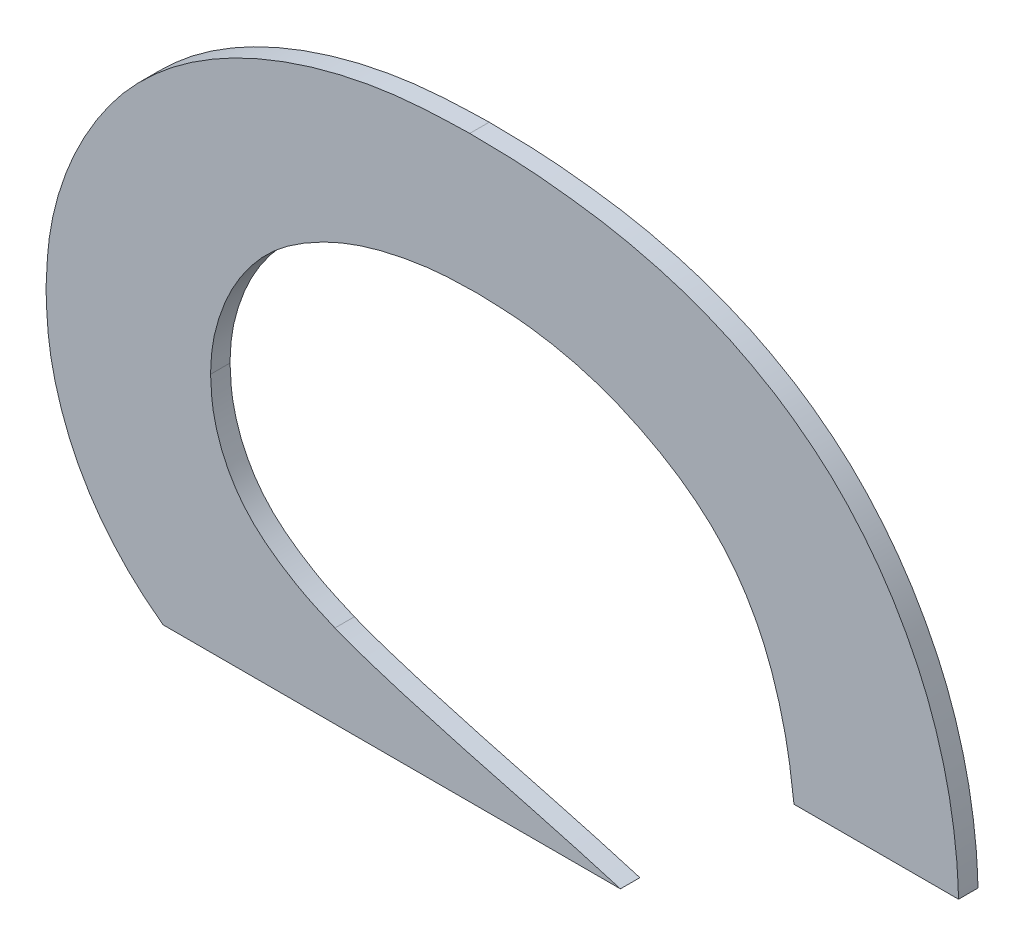
ISO-10303-21;
HEADER;
FILE_DESCRIPTION(('STEP AP214'),'2;1');
FILE_NAME('part.step','',(''),(''),'','','');
FILE_SCHEMA(('AUTOMOTIVE_DESIGN { 1 0 10303 214 1 1 1 1 }'));
ENDSEC;
DATA;
#1=APPLICATION_CONTEXT('core data for automotive mechanical design processes');
#2=APPLICATION_PROTOCOL_DEFINITION('international standard','automotive_design',2000,#1);
#3=PRODUCT_CONTEXT('',#1,'mechanical');
#4=PRODUCT('Part','Part','',(#3));
#5=PRODUCT_RELATED_PRODUCT_CATEGORY('part','',(#4));
#6=PRODUCT_DEFINITION_FORMATION('','',#4);
#7=PRODUCT_DEFINITION_CONTEXT('part definition',#1,'design');
#8=PRODUCT_DEFINITION('design','',#6,#7);
#9=PRODUCT_DEFINITION_SHAPE('','',#8);
#10=(LENGTH_UNIT() NAMED_UNIT(*) SI_UNIT(.MILLI.,.METRE.));
#11=(NAMED_UNIT(*) PLANE_ANGLE_UNIT() SI_UNIT($,.RADIAN.));
#12=(NAMED_UNIT(*) SI_UNIT($,.STERADIAN.) SOLID_ANGLE_UNIT());
#13=UNCERTAINTY_MEASURE_WITH_UNIT(LENGTH_MEASURE(1.E-05),#10,'distance_accuracy_value','');
#14=(GEOMETRIC_REPRESENTATION_CONTEXT(3) GLOBAL_UNCERTAINTY_ASSIGNED_CONTEXT((#13)) GLOBAL_UNIT_ASSIGNED_CONTEXT((#10,
#11,#12)) REPRESENTATION_CONTEXT('',''));
#15=CARTESIAN_POINT('',(0.,0.,0.));
#16=DIRECTION('',(0.,0.,1.));
#17=DIRECTION('',(1.,0.,0.));
#18=AXIS2_PLACEMENT_3D('',#15,#16,#17);
#19=CARTESIAN_POINT('',(-4.11057692307693,2.63822115384615,0.5));
#20=CARTESIAN_POINT('',(-4.00488563491304,2.59484832968436,0.5));
#21=CARTESIAN_POINT('',(-3.76610981470805,2.49686124064652,0.5));
#22=CARTESIAN_POINT('',(-3.35685527949907,2.36715662740571,0.5));
#23=CARTESIAN_POINT('',(-2.87124370624223,2.19936163482354,0.5));
#24=CARTESIAN_POINT('',(-2.29933905732658,2.0274498742162,0.5));
#25=CARTESIAN_POINT('',(-1.64054876163488,1.84325418191542,0.5));
#26=CARTESIAN_POINT('',(-0.900915829956285,1.6312743935958,0.5));
#27=CARTESIAN_POINT('',(-0.0745724746301278,1.41053081331135,0.5));
#28=CARTESIAN_POINT('',(0.809542130683225,1.17684129858742,0.5));
#29=CARTESIAN_POINT('',(1.70446327038373,0.939812681982956,0.5));
#30=CARTESIAN_POINT('',(2.55933319638908,0.697455477380349,0.5));
#31=CARTESIAN_POINT('',(3.3507051088732,0.467590704325735,0.5));
#32=CARTESIAN_POINT('',(4.07556666863736,0.231341690606483,0.5));
#33=CARTESIAN_POINT('',(4.73461203592151,-0.00182823693737234,0.5));
#34=CARTESIAN_POINT('',(5.32964173384311,-0.230412348593631,0.5));
#35=CARTESIAN_POINT('',(5.86171425100135,-0.448722393173916,0.5));
#36=CARTESIAN_POINT('',(6.1866759407189,-0.609273403606434,0.5));
#37=CARTESIAN_POINT('',(6.34014423076923,-0.685096153846154,0.5));
#38=B_SPLINE_CURVE_WITH_KNOTS('',3,(#19,#20,#21,#22,#23,#24,#25,#26,#27,#28,#29,#30,#31,#32,#33,
#34,#35,#36,#37),.UNSPECIFIED.,.F.,.F.,(4,1,1,1,1,1,1,1,1,1,1,1,1,1,1,1,4),(0.,
0.0312005486837909,0.0704877074756246,0.117216473764155,0.171577933057924,0.233598664496505,
0.304114665578319,0.381780268712742,0.467272049488307,0.553962424494241,0.634702640990441,
0.710032621623598,0.779089305911882,0.842963443203923,0.900999818556514,0.953245600815253,1.),.UNSPECIFIED.);
#39=DIRECTION('',(0.,0.,1.));
#40=VECTOR('',#39,1.);
#41=SURFACE_OF_LINEAR_EXTRUSION('',#38,#40);
#42=CARTESIAN_POINT('',(-4.11057692307693,2.63822115384615,1.));
#43=CARTESIAN_POINT('',(-4.00488563491304,2.59484832968436,1.));
#44=CARTESIAN_POINT('',(-3.76610981470805,2.49686124064652,1.));
#45=CARTESIAN_POINT('',(-3.35685527949907,2.36715662740571,1.));
#46=CARTESIAN_POINT('',(-2.87124370624223,2.19936163482354,1.));
#47=CARTESIAN_POINT('',(-2.29933905732658,2.0274498742162,1.));
#48=CARTESIAN_POINT('',(-1.64054876163488,1.84325418191542,1.));
#49=CARTESIAN_POINT('',(-0.900915829956285,1.6312743935958,1.));
#50=CARTESIAN_POINT('',(-0.0745724746301278,1.41053081331135,1.));
#51=CARTESIAN_POINT('',(0.809542130683225,1.17684129858742,1.));
#52=CARTESIAN_POINT('',(1.70446327038373,0.939812681982956,1.));
#53=CARTESIAN_POINT('',(2.5118826485852,0.710907795414684,1.));
#54=CARTESIAN_POINT('',(3.01321470962642,0.565590876212145,1.));
#55=CARTESIAN_POINT('',(3.22990136181697,0.499989275649873,1.));
#56=B_SPLINE_CURVE_WITH_KNOTS('',3,(#42,#43,#44,#45,#46,#47,#48,#49,#50,#51,#52,#53,#54,#55),
.UNSPECIFIED.,.F.,.F.,(4,1,1,1,1,1,1,1,1,1,1,4),(0.,0.0312005486837909,0.0704877074756246,
0.117216473764155,0.171577933057924,0.233598664496505,0.304114665578319,0.381780268712742,
0.467272049488307,0.553962424494241,0.634702640990441,0.696557914206025),.UNSPECIFIED.);
#57=CARTESIAN_POINT('',(-4.11057692307693,2.63822115384615,1.));
#58=VERTEX_POINT('',#57);
#59=CARTESIAN_POINT('',(3.22990463264559,0.5,1.000025));
#60=VERTEX_POINT('',#59);
#61=EDGE_CURVE('E154',#58,#60,#56,.T.);
#62=ORIENTED_EDGE('',*,*,#61,.T.);
#63=DIRECTION('',(0.,0.,1.));
#64=VECTOR('',#63,1.);
#65=CARTESIAN_POINT('',(3.22986593845968,0.5,0.5));
#66=LINE('',#65,#64);
#67=CARTESIAN_POINT('',(3.22986597011107,0.5,0.5));
#68=VERTEX_POINT('',#67);
#69=EDGE_CURVE('E59',#60,#68,#66,.F.);
#70=ORIENTED_EDGE('',*,*,#69,.T.);
#71=CARTESIAN_POINT('',(-4.11057692307693,2.63822115384615,0.5));
#72=VERTEX_POINT('',#71);
#73=EDGE_CURVE('E130',#72,#68,#38,.T.);
#74=ORIENTED_EDGE('',*,*,#73,.F.);
#75=DIRECTION('',(0.,0.,1.));
#76=VECTOR('',#75,1.);
#77=CARTESIAN_POINT('',(-4.11057692307693,2.63822115384615,0.5));
#78=LINE('',#77,#76);
#79=EDGE_CURVE('E121',#72,#58,#78,.T.);
#80=ORIENTED_EDGE('',*,*,#79,.T.);
#81=EDGE_LOOP('',(#62,#70,#74,#80));
#82=FACE_BOUND('',#81,.T.);
#83=ADVANCED_FACE('F39',(#82),#41,.F.);
#84=CARTESIAN_POINT('',(-6.33413461538462,-0.769230769230769,0.5));
#85=CARTESIAN_POINT('',(-6.54987491010937,-0.669834901235198,0.5));
#86=CARTESIAN_POINT('',(-6.97333695426159,-0.47473746941149,0.5));
#87=CARTESIAN_POINT('',(-7.57252879000224,-0.140673929581436,0.5));
#88=CARTESIAN_POINT('',(-8.1352725755817,0.203254546695419,0.5));
#89=CARTESIAN_POINT('',(-8.64404485130398,0.582245472711802,0.5));
#90=CARTESIAN_POINT('',(-9.12384569204833,0.961743307487882,0.5));
#91=CARTESIAN_POINT('',(-9.55020307049261,1.37201275767485,0.5));
#92=CARTESIAN_POINT('',(-9.9322881781385,1.80340001840364,0.5));
#93=CARTESIAN_POINT('',(-10.3848849345274,2.39611039997635,0.5));
#94=CARTESIAN_POINT('',(-10.8491453548823,3.19611819473388,0.5));
#95=CARTESIAN_POINT('',(-11.2480287422914,4.23007263462684,0.5));
#96=CARTESIAN_POINT('',(-11.4975406108777,5.33476645352021,0.5));
#97=CARTESIAN_POINT('',(-11.524652430869,6.09643002795245,0.5));
#98=CARTESIAN_POINT('',(-11.5384615384615,6.484375,0.5));
#99=B_SPLINE_CURVE_WITH_KNOTS('',3,(#84,#85,#86,#87,#88,#89,#90,#91,#92,#93,#94,#95,#96,#97,
#98),.UNSPECIFIED.,.F.,.F.,(4,1,1,1,1,1,1,1,1,1,1,1,4),(0.,0.0749469658775914,0.147108334184966,
0.216409674186856,0.282932407800131,0.347217926398502,0.409378758984855,0.469396312600535,
0.528959181231001,0.644562709826563,0.759868442406739,0.877691629841046,1.),.UNSPECIFIED.);
#100=DIRECTION('',(0.,0.,1.));
#101=VECTOR('',#100,1.);
#102=SURFACE_OF_LINEAR_EXTRUSION('',#99,#101);
#103=CARTESIAN_POINT('',(-8.53108296981489,0.499999998261416,0.5));
#104=VERTEX_POINT('',#103);
#105=CARTESIAN_POINT('',(-11.5384615384615,6.484375,0.5));
#106=VERTEX_POINT('',#105);
#107=EDGE_CURVE('E122',#104,#106,#99,.T.);
#108=ORIENTED_EDGE('',*,*,#107,.F.);
#109=DIRECTION('',(0.,0.,1.));
#110=VECTOR('',#109,1.);
#111=CARTESIAN_POINT('',(-8.53108297211848,0.499999999999961,0.5));
#112=LINE('',#111,#110);
#113=CARTESIAN_POINT('',(-8.53108297215093,0.499999999999981,1.));
#114=VERTEX_POINT('',#113);
#115=EDGE_CURVE('E109',#104,#114,#112,.T.);
#116=ORIENTED_EDGE('',*,*,#115,.T.);
#117=CARTESIAN_POINT('',(-6.33413461538462,-0.769230769230769,1.));
#118=CARTESIAN_POINT('',(-6.54987491010937,-0.669834901235198,1.));
#119=CARTESIAN_POINT('',(-6.97333695426159,-0.47473746941149,1.));
#120=CARTESIAN_POINT('',(-7.57252879000224,-0.140673929581436,1.));
#121=CARTESIAN_POINT('',(-8.1352725755817,0.203254546695419,1.));
#122=CARTESIAN_POINT('',(-8.64404485130398,0.582245472711802,1.));
#123=CARTESIAN_POINT('',(-9.12384569204833,0.961743307487882,1.));
#124=CARTESIAN_POINT('',(-9.55020307049261,1.37201275767485,1.));
#125=CARTESIAN_POINT('',(-9.9322881781385,1.80340001840364,1.));
#126=CARTESIAN_POINT('',(-10.3848849345274,2.39611039997635,1.));
#127=CARTESIAN_POINT('',(-10.8491453548823,3.19611819473388,1.));
#128=CARTESIAN_POINT('',(-11.2480287422914,4.23007263462684,1.));
#129=CARTESIAN_POINT('',(-11.4975406108777,5.33476645352021,1.));
#130=CARTESIAN_POINT('',(-11.524652430869,6.09643002795245,1.));
#131=CARTESIAN_POINT('',(-11.5384615384615,6.484375,1.));
#132=B_SPLINE_CURVE_WITH_KNOTS('',3,(#117,#118,#119,#120,#121,#122,#123,#124,#125,#126,#127,
#128,#129,#130,#131),.UNSPECIFIED.,.F.,.F.,(4,1,1,1,1,1,1,1,1,1,1,1,4),(0.,0.0749469658775914,
0.147108334184966,0.216409674186856,0.282932407800131,0.347217926398502,0.409378758984855,
0.469396312600535,0.528959181231001,0.644562709826563,0.759868442406739,0.877691629841046,1.),.UNSPECIFIED.);
#133=CARTESIAN_POINT('',(-11.5384615384615,6.484375,1.));
#134=VERTEX_POINT('',#133);
#135=EDGE_CURVE('E123',#114,#134,#132,.T.);
#136=ORIENTED_EDGE('',*,*,#135,.T.);
#137=DIRECTION('',(0.,0.,1.));
#138=VECTOR('',#137,1.);
#139=CARTESIAN_POINT('',(-11.5384615384615,6.484375,0.5));
#140=LINE('',#139,#138);
#141=EDGE_CURVE('E11',#106,#134,#140,.T.);
#142=ORIENTED_EDGE('',*,*,#141,.F.);
#143=EDGE_LOOP('',(#108,#116,#136,#142));
#144=FACE_BOUND('',#143,.T.);
#145=ADVANCED_FACE('F116',(#144),#102,.F.);
#146=CARTESIAN_POINT('',(8.143057134103,12.8301208020986,0.5));
#147=DIRECTION('',(0.,0.,1.));
#148=DIRECTION('',(1.,0.,0.));
#149=AXIS2_PLACEMENT_3D('',#146,#147,#148);
#150=PLANE('',#149);
#151=ORIENTED_EDGE('',*,*,#73,.T.);
#152=DIRECTION('',(-1.,0.,0.));
#153=VECTOR('',#152,1.);
#154=CARTESIAN_POINT('',(8.143057134103,0.5,0.5));
#155=LINE('',#154,#153);
#156=EDGE_CURVE('E127',#68,#104,#155,.T.);
#157=ORIENTED_EDGE('',*,*,#156,.T.);
#158=ORIENTED_EDGE('',*,*,#107,.T.);
#159=CARTESIAN_POINT('',(-11.5384615384615,6.484375,0.5));
#160=CARTESIAN_POINT('',(-11.5225576215417,6.87638526498406,0.5));
#161=CARTESIAN_POINT('',(-11.490903658382,7.65661308864469,0.5));
#162=CARTESIAN_POINT('',(-11.2263730788978,8.80495949089993,0.5));
#163=CARTESIAN_POINT('',(-10.8019246925907,9.91540908347788,0.5));
#164=CARTESIAN_POINT('',(-10.3106668393468,10.7963752693933,0.5));
#165=CARTESIAN_POINT('',(-9.84443875315438,11.4702710474641,0.5));
#166=CARTESIAN_POINT('',(-9.45291305126322,11.9546766294584,0.5));
#167=CARTESIAN_POINT('',(-9.01869917537449,12.4025724829247,0.5));
#168=CARTESIAN_POINT('',(-8.55252743938567,12.8280066132326,0.5));
#169=CARTESIAN_POINT('',(-8.05076576578978,13.2222873362771,0.5));
#170=CARTESIAN_POINT('',(-7.5091939873683,13.5855791407353,0.5));
#171=CARTESIAN_POINT('',(-6.9335001808275,13.9215505243502,0.5));
#172=CARTESIAN_POINT('',(-6.11153811204496,14.3314100828789,0.5));
#173=CARTESIAN_POINT('',(-5.01853352981579,14.757031912679,0.5));
#174=CARTESIAN_POINT('',(-3.63054327775144,15.1261990078088,0.5));
#175=CARTESIAN_POINT('',(-2.16242376669399,15.3449482282785,0.5));
#176=CARTESIAN_POINT('',(-1.15659361485031,15.3712076433537,0.5));
#177=CARTESIAN_POINT('',(-0.643028846153849,15.3846153846154,0.5));
#178=B_SPLINE_CURVE_WITH_KNOTS('',3,(#159,#160,#161,#162,#163,#164,#165,#166,#167,#168,#169,
#170,#171,#172,#173,#174,#175,#176,#177),.UNSPECIFIED.,.F.,.F.,(4,1,1,1,1,1,1,1,1,1,1,1,1,1,1,1,
4),(0.,0.0748117115240047,0.148899618404312,0.223875566693112,0.301295956829367,
0.340890212879302,0.38033440242574,0.420118666246839,0.459939719666905,0.500818643036389,
0.541892326895964,0.584421526484038,0.628060421576672,0.717241857708062,0.807927775014171,
0.901930233830183,1.),.UNSPECIFIED.);
#179=CARTESIAN_POINT('',(-0.643028846153849,15.3846153846154,0.5));
#180=VERTEX_POINT('',#179);
#181=EDGE_CURVE('E196',#106,#180,#178,.T.);
#182=ORIENTED_EDGE('',*,*,#181,.T.);
#183=CARTESIAN_POINT('',(-0.643028846153849,15.3846153846154,0.5));
#184=CARTESIAN_POINT('',(-0.316432315942807,15.381573958658,0.5));
#185=CARTESIAN_POINT('',(0.325322874606511,15.3755976217584,0.5));
#186=CARTESIAN_POINT('',(1.26624928914583,15.3163462373829,0.5));
#187=CARTESIAN_POINT('',(2.16537313488566,15.2092957624701,0.5));
#188=CARTESIAN_POINT('',(3.02629156849099,15.0853879943502,0.5));
#189=CARTESIAN_POINT('',(3.84494325787476,14.8991576800147,0.5));
#190=CARTESIAN_POINT('',(4.62602560000437,14.6890294642314,0.5));
#191=CARTESIAN_POINT('',(5.36241383764557,14.4254165104329,0.5));
#192=CARTESIAN_POINT('',(6.0622169595001,14.1353845457881,0.5));
#193=CARTESIAN_POINT('',(6.71902831170855,13.7926823427161,0.5));
#194=CARTESIAN_POINT('',(7.34663864691437,13.4253859364261,0.5));
#195=CARTESIAN_POINT('',(7.92986033230254,13.0040520971958,0.5));
#196=CARTESIAN_POINT('',(8.48597333825746,12.5572305060815,0.5));
#197=CARTESIAN_POINT('',(8.99819847099631,12.0601496740678,0.5));
#198=CARTESIAN_POINT('',(9.47246234599136,11.5244094200153,0.5));
#199=CARTESIAN_POINT('',(9.9139197574496,10.9512271849259,0.5));
#200=CARTESIAN_POINT('',(10.3147442116856,10.339983317138,0.5));
#201=CARTESIAN_POINT('',(10.6725686956029,9.69768654580665,0.5));
#202=CARTESIAN_POINT('',(10.9947001111911,9.03550068099126,0.5));
#203=CARTESIAN_POINT('',(11.264282464694,8.34989351224467,0.5));
#204=CARTESIAN_POINT('',(11.4864407196589,7.64247684810131,0.5));
#205=CARTESIAN_POINT('',(11.6682931361049,6.91646203900332,0.5));
#206=CARTESIAN_POINT('',(11.7979594494024,6.16701296410265,0.5));
#207=CARTESIAN_POINT('',(11.8920890650247,5.3988312723119,0.5));
#208=CARTESIAN_POINT('',(11.9126866254421,4.87807601963552,0.5));
#209=CARTESIAN_POINT('',(11.9230769230769,4.61538461538461,0.5));
#210=B_SPLINE_CURVE_WITH_KNOTS('',3,(#183,#184,#185,#186,#187,#188,#189,#190,#191,#192,#193,
#194,#195,#196,#197,#198,#199,#200,#201,#202,#203,#204,#205,#206,#207,#208,#209),.UNSPECIFIED.,
.F.,.F.,(4,1,1,1,1,1,1,1,1,1,1,1,1,1,1,1,1,1,1,1,1,1,1,1,4),(0.,0.0524970732681834,
0.103155625189081,0.151446900106166,0.198036575027614,0.242883227500694,0.286320436007602,
0.327974832728672,0.368524234979793,0.407985003019775,0.446973898177788,0.485305667733629,
0.523527722287358,0.561559399691927,0.599880347178225,0.638460186486789,0.677757696945738,
0.717260486447785,0.756579100491773,0.796045123661361,0.835559723648034,0.875703056245892,
0.916256294104429,0.957756063744298,1.),.UNSPECIFIED.);
#211=CARTESIAN_POINT('',(11.9230769230769,4.61538461538461,0.5));
#212=VERTEX_POINT('',#211);
#213=EDGE_CURVE('E209',#180,#212,#210,.T.);
#214=ORIENTED_EDGE('',*,*,#213,.T.);
#215=DIRECTION('',(-1.,0.,0.));
#216=VECTOR('',#215,1.);
#217=CARTESIAN_POINT('',(11.9230769230769,4.61538461538461,0.5));
#218=LINE('',#217,#216);
#219=CARTESIAN_POINT('',(7.69230769230769,4.61538461538461,0.5));
#220=VERTEX_POINT('',#219);
#221=EDGE_CURVE('E251',#212,#220,#218,.T.);
#222=ORIENTED_EDGE('',*,*,#221,.T.);
#223=CARTESIAN_POINT('',(7.69230769230769,4.61538461538461,0.5));
#224=CARTESIAN_POINT('',(7.64587787474954,4.99530713753295,0.5));
#225=CARTESIAN_POINT('',(7.55668369503909,5.72515876088058,0.5));
#226=CARTESIAN_POINT('',(7.30531345790411,6.75869479961788,0.5));
#227=CARTESIAN_POINT('',(6.98864581756741,7.69036663653895,0.5));
#228=CARTESIAN_POINT('',(6.57197195884964,8.51921807268415,0.5));
#229=CARTESIAN_POINT('',(6.06018848324613,9.26497379863621,0.5));
#230=CARTESIAN_POINT('',(5.41986707195258,9.92539822823579,0.5));
#231=CARTESIAN_POINT('',(4.65095157179606,10.5051357324702,0.5));
#232=CARTESIAN_POINT('',(3.77157005159758,11.000847134862,0.5));
#233=CARTESIAN_POINT('',(2.80934883085643,11.4184131811532,0.5));
#234=CARTESIAN_POINT('',(1.77278155163136,11.7113430003302,0.5));
#235=CARTESIAN_POINT('',(0.677210589100653,11.8889758757304,0.5));
#236=CARTESIAN_POINT('',(-0.0734375650773165,11.9115501367873,0.5));
#237=CARTESIAN_POINT('',(-0.456730769230772,11.9230769230769,0.5));
#238=B_SPLINE_CURVE_WITH_KNOTS('',3,(#223,#224,#225,#226,#227,#228,#229,#230,#231,#232,#233,
#234,#235,#236,#237),.UNSPECIFIED.,.F.,.F.,(4,1,1,1,1,1,1,1,1,1,1,1,4),(0.,0.0938134373941734,
0.180220664957644,0.260410288357706,0.334686523362959,0.407066114797914,0.48143493828116,
0.559271549945897,0.642465597837718,0.728536848906627,0.815944257740894,0.906018132728787,1.),.UNSPECIFIED.);
#239=CARTESIAN_POINT('',(-0.456730769230772,11.9230769230769,0.5));
#240=VERTEX_POINT('',#239);
#241=EDGE_CURVE('E275',#220,#240,#238,.T.);
#242=ORIENTED_EDGE('',*,*,#241,.T.);
#243=CARTESIAN_POINT('',(-0.456730769230772,11.9230769230769,0.5));
#244=CARTESIAN_POINT('',(-0.795849386530795,11.9167707334124,0.5));
#245=CARTESIAN_POINT('',(-1.45508090461675,11.9045117810171,0.5));
#246=CARTESIAN_POINT('',(-2.41252036035202,11.7582061635775,0.5));
#247=CARTESIAN_POINT('',(-3.31090380299915,11.5417598516276,0.5));
#248=CARTESIAN_POINT('',(-4.14052558842798,11.2304603284967,0.5));
#249=CARTESIAN_POINT('',(-4.88471292665653,10.8391539068335,0.5));
#250=CARTESIAN_POINT('',(-5.54527430096077,10.3923440842166,0.5));
#251=CARTESIAN_POINT('',(-6.0931400703211,9.85986201567553,0.5));
#252=CARTESIAN_POINT('',(-6.53630891911056,9.271334779326,0.5));
#253=CARTESIAN_POINT('',(-6.88023275644289,8.64637115441223,0.5));
#254=CARTESIAN_POINT('',(-7.12000437248346,8.00162539233591,0.5));
#255=CARTESIAN_POINT('',(-7.28143433068,7.34965267945314,0.5));
#256=CARTESIAN_POINT('',(-7.29898116346477,6.90797385569359,0.5));
#257=CARTESIAN_POINT('',(-7.30769230769231,6.68870192307692,0.5));
#258=B_SPLINE_CURVE_WITH_KNOTS('',3,(#243,#244,#245,#246,#247,#248,#249,#250,#251,#252,#253,
#254,#255,#256,#257),.UNSPECIFIED.,.F.,.F.,(4,1,1,1,1,1,1,1,1,1,1,1,4),(0.,0.10562867696303,
0.205337452783204,0.301211862368684,0.393306124662646,0.480736436132882,0.562848666423936,
0.641019285521346,0.717706609281672,0.791768156300893,0.86252000064479,0.9317479047373,1.),.UNSPECIFIED.);
#259=CARTESIAN_POINT('',(-7.30769230769231,6.68870192307692,0.5));
#260=VERTEX_POINT('',#259);
#261=EDGE_CURVE('E276',#240,#260,#258,.T.);
#262=ORIENTED_EDGE('',*,*,#261,.T.);
#263=CARTESIAN_POINT('',(-7.30769230769231,6.68870192307692,0.5));
#264=CARTESIAN_POINT('',(-7.29850187616985,6.47158135474501,0.5));
#265=CARTESIAN_POINT('',(-7.28052073803509,6.0467835722326,0.5));
#266=CARTESIAN_POINT('',(-7.1378801967622,5.43185883367378,0.5));
#267=CARTESIAN_POINT('',(-6.90738722912524,4.85968854338124,0.5));
#268=CARTESIAN_POINT('',(-6.58406217986877,4.32539161034355,0.5));
#269=CARTESIAN_POINT('',(-6.14463469907696,3.832198990696,0.5));
#270=CARTESIAN_POINT('',(-5.57640215117264,3.39439087275603,0.5));
#271=CARTESIAN_POINT('',(-4.89519367475371,2.97796489296251,0.5));
#272=CARTESIAN_POINT('',(-4.38231273665071,2.75588438389838,0.5));
#273=CARTESIAN_POINT('',(-4.11057692307693,2.63822115384615,0.5));
#274=B_SPLINE_CURVE_WITH_KNOTS('',3,(#263,#264,#265,#266,#267,#268,#269,#270,#271,#272,#273),
.UNSPECIFIED.,.F.,.F.,(4,1,1,1,1,1,1,1,4),(0.,0.117760207302278,0.230398599794273,
0.340649752846931,0.451425175584356,0.567735582646192,0.696970780221766,0.839448329123652,1.),.UNSPECIFIED.);
#275=EDGE_CURVE('E117',#260,#72,#274,.T.);
#276=ORIENTED_EDGE('',*,*,#275,.T.);
#277=EDGE_LOOP('',(#151,#157,#158,#182,#214,#222,#242,#262,#276));
#278=FACE_BOUND('',#277,.T.);
#279=ADVANCED_FACE('F224',(#278),#150,.F.);
#280=CARTESIAN_POINT('',(8.143057134103,12.8301208020986,1.));
#281=DIRECTION('',(0.,0.,1.));
#282=DIRECTION('',(1.,0.,0.));
#283=AXIS2_PLACEMENT_3D('',#280,#281,#282);
#284=PLANE('',#283);
#285=ORIENTED_EDGE('',*,*,#135,.F.);
#286=DIRECTION('',(1.,0.,0.));
#287=VECTOR('',#286,1.);
#288=CARTESIAN_POINT('',(8.143057134103,0.5,1.));
#289=LINE('',#288,#287);
#290=EDGE_CURVE('E106',#114,#60,#289,.T.);
#291=ORIENTED_EDGE('',*,*,#290,.T.);
#292=ORIENTED_EDGE('',*,*,#61,.F.);
#293=CARTESIAN_POINT('',(-7.30769230769231,6.68870192307692,1.));
#294=CARTESIAN_POINT('',(-7.29850187616985,6.47158135474501,1.));
#295=CARTESIAN_POINT('',(-7.28052073803509,6.0467835722326,1.));
#296=CARTESIAN_POINT('',(-7.1378801967622,5.43185883367378,1.));
#297=CARTESIAN_POINT('',(-6.90738722912524,4.85968854338124,1.));
#298=CARTESIAN_POINT('',(-6.58406217986877,4.32539161034355,1.));
#299=CARTESIAN_POINT('',(-6.14463469907696,3.832198990696,1.));
#300=CARTESIAN_POINT('',(-5.57640215117264,3.39439087275603,1.));
#301=CARTESIAN_POINT('',(-4.89519367475371,2.97796489296251,1.));
#302=CARTESIAN_POINT('',(-4.38231273665071,2.75588438389838,1.));
#303=CARTESIAN_POINT('',(-4.11057692307693,2.63822115384615,1.));
#304=B_SPLINE_CURVE_WITH_KNOTS('',3,(#293,#294,#295,#296,#297,#298,#299,#300,#301,#302,#303),
.UNSPECIFIED.,.F.,.F.,(4,1,1,1,1,1,1,1,4),(0.,0.117760207302278,0.230398599794273,
0.340649752846931,0.451425175584356,0.567735582646192,0.696970780221766,0.839448329123652,1.),.UNSPECIFIED.);
#305=CARTESIAN_POINT('',(-7.30769230769231,6.68870192307692,1.));
#306=VERTEX_POINT('',#305);
#307=EDGE_CURVE('E155',#306,#58,#304,.T.);
#308=ORIENTED_EDGE('',*,*,#307,.F.);
#309=CARTESIAN_POINT('',(-0.456730769230772,11.9230769230769,1.));
#310=CARTESIAN_POINT('',(-0.795849386530795,11.9167707334124,1.));
#311=CARTESIAN_POINT('',(-1.45508090461675,11.9045117810171,1.));
#312=CARTESIAN_POINT('',(-2.41252036035202,11.7582061635775,1.));
#313=CARTESIAN_POINT('',(-3.31090380299915,11.5417598516276,1.));
#314=CARTESIAN_POINT('',(-4.14052558842798,11.2304603284967,1.));
#315=CARTESIAN_POINT('',(-4.88471292665653,10.8391539068335,1.));
#316=CARTESIAN_POINT('',(-5.54527430096077,10.3923440842166,1.));
#317=CARTESIAN_POINT('',(-6.0931400703211,9.85986201567553,1.));
#318=CARTESIAN_POINT('',(-6.53630891911056,9.271334779326,1.));
#319=CARTESIAN_POINT('',(-6.88023275644289,8.64637115441223,1.));
#320=CARTESIAN_POINT('',(-7.12000437248346,8.00162539233591,1.));
#321=CARTESIAN_POINT('',(-7.28143433068,7.34965267945314,1.));
#322=CARTESIAN_POINT('',(-7.29898116346477,6.90797385569359,1.));
#323=CARTESIAN_POINT('',(-7.30769230769231,6.68870192307692,1.));
#324=B_SPLINE_CURVE_WITH_KNOTS('',3,(#309,#310,#311,#312,#313,#314,#315,#316,#317,#318,#319,
#320,#321,#322,#323),.UNSPECIFIED.,.F.,.F.,(4,1,1,1,1,1,1,1,1,1,1,1,4),(0.,0.10562867696303,
0.205337452783204,0.301211862368684,0.393306124662646,0.480736436132882,0.562848666423936,
0.641019285521346,0.717706609281672,0.791768156300893,0.86252000064479,0.9317479047373,1.),.UNSPECIFIED.);
#325=CARTESIAN_POINT('',(-0.456730769230772,11.9230769230769,1.));
#326=VERTEX_POINT('',#325);
#327=EDGE_CURVE('E168',#326,#306,#324,.T.);
#328=ORIENTED_EDGE('',*,*,#327,.F.);
#329=CARTESIAN_POINT('',(7.69230769230769,4.61538461538461,1.));
#330=CARTESIAN_POINT('',(7.64587787474954,4.99530713753295,1.));
#331=CARTESIAN_POINT('',(7.55668369503909,5.72515876088058,1.));
#332=CARTESIAN_POINT('',(7.30531345790411,6.75869479961788,1.));
#333=CARTESIAN_POINT('',(6.98864581756741,7.69036663653895,1.));
#334=CARTESIAN_POINT('',(6.57197195884964,8.51921807268415,1.));
#335=CARTESIAN_POINT('',(6.06018848324613,9.26497379863621,1.));
#336=CARTESIAN_POINT('',(5.41986707195258,9.92539822823579,1.));
#337=CARTESIAN_POINT('',(4.65095157179606,10.5051357324702,1.));
#338=CARTESIAN_POINT('',(3.77157005159758,11.000847134862,1.));
#339=CARTESIAN_POINT('',(2.80934883085643,11.4184131811532,1.));
#340=CARTESIAN_POINT('',(1.77278155163136,11.7113430003302,1.));
#341=CARTESIAN_POINT('',(0.677210589100653,11.8889758757304,1.));
#342=CARTESIAN_POINT('',(-0.0734375650773165,11.9115501367873,1.));
#343=CARTESIAN_POINT('',(-0.456730769230772,11.9230769230769,1.));
#344=B_SPLINE_CURVE_WITH_KNOTS('',3,(#329,#330,#331,#332,#333,#334,#335,#336,#337,#338,#339,
#340,#341,#342,#343),.UNSPECIFIED.,.F.,.F.,(4,1,1,1,1,1,1,1,1,1,1,1,4),(0.,0.0938134373941734,
0.180220664957644,0.260410288357706,0.334686523362959,0.407066114797914,0.48143493828116,
0.559271549945897,0.642465597837718,0.728536848906627,0.815944257740894,0.906018132728787,1.),.UNSPECIFIED.);
#345=CARTESIAN_POINT('',(7.69230769230769,4.61538461538461,1.));
#346=VERTEX_POINT('',#345);
#347=EDGE_CURVE('E162',#346,#326,#344,.T.);
#348=ORIENTED_EDGE('',*,*,#347,.F.);
#349=DIRECTION('',(-1.,0.,0.));
#350=VECTOR('',#349,1.);
#351=CARTESIAN_POINT('',(11.9230769230769,4.61538461538461,1.));
#352=LINE('',#351,#350);
#353=CARTESIAN_POINT('',(11.9230769230769,4.61538461538461,1.));
#354=VERTEX_POINT('',#353);
#355=EDGE_CURVE('E164',#354,#346,#352,.T.);
#356=ORIENTED_EDGE('',*,*,#355,.F.);
#357=CARTESIAN_POINT('',(-0.643028846153849,15.3846153846154,1.));
#358=CARTESIAN_POINT('',(-0.316432315942807,15.381573958658,1.));
#359=CARTESIAN_POINT('',(0.325322874606511,15.3755976217584,1.));
#360=CARTESIAN_POINT('',(1.26624928914583,15.3163462373829,1.));
#361=CARTESIAN_POINT('',(2.16537313488566,15.2092957624701,1.));
#362=CARTESIAN_POINT('',(3.02629156849099,15.0853879943502,1.));
#363=CARTESIAN_POINT('',(3.84494325787476,14.8991576800147,1.));
#364=CARTESIAN_POINT('',(4.62602560000437,14.6890294642314,1.));
#365=CARTESIAN_POINT('',(5.36241383764557,14.4254165104329,1.));
#366=CARTESIAN_POINT('',(6.0622169595001,14.1353845457881,1.));
#367=CARTESIAN_POINT('',(6.71902831170855,13.7926823427161,1.));
#368=CARTESIAN_POINT('',(7.34663864691437,13.4253859364261,1.));
#369=CARTESIAN_POINT('',(7.92986033230254,13.0040520971958,1.));
#370=CARTESIAN_POINT('',(8.48597333825746,12.5572305060815,1.));
#371=CARTESIAN_POINT('',(8.99819847099631,12.0601496740678,1.));
#372=CARTESIAN_POINT('',(9.47246234599136,11.5244094200153,1.));
#373=CARTESIAN_POINT('',(9.9139197574496,10.9512271849259,1.));
#374=CARTESIAN_POINT('',(10.3147442116856,10.339983317138,1.));
#375=CARTESIAN_POINT('',(10.6725686956029,9.69768654580665,1.));
#376=CARTESIAN_POINT('',(10.9947001111911,9.03550068099126,1.));
#377=CARTESIAN_POINT('',(11.264282464694,8.34989351224467,1.));
#378=CARTESIAN_POINT('',(11.4864407196589,7.64247684810131,1.));
#379=CARTESIAN_POINT('',(11.6682931361049,6.91646203900332,1.));
#380=CARTESIAN_POINT('',(11.7979594494024,6.16701296410265,1.));
#381=CARTESIAN_POINT('',(11.8920890650247,5.3988312723119,1.));
#382=CARTESIAN_POINT('',(11.9126866254421,4.87807601963552,1.));
#383=CARTESIAN_POINT('',(11.9230769230769,4.61538461538461,1.));
#384=B_SPLINE_CURVE_WITH_KNOTS('',3,(#357,#358,#359,#360,#361,#362,#363,#364,#365,#366,#367,
#368,#369,#370,#371,#372,#373,#374,#375,#376,#377,#378,#379,#380,#381,#382,#383),.UNSPECIFIED.,
.F.,.F.,(4,1,1,1,1,1,1,1,1,1,1,1,1,1,1,1,1,1,1,1,1,1,1,1,4),(0.,0.0524970732681834,
0.103155625189081,0.151446900106166,0.198036575027614,0.242883227500694,0.286320436007602,
0.327974832728672,0.368524234979793,0.407985003019775,0.446973898177788,0.485305667733629,
0.523527722287358,0.561559399691927,0.599880347178225,0.638460186486789,0.677757696945738,
0.717260486447785,0.756579100491773,0.796045123661361,0.835559723648034,0.875703056245892,
0.916256294104429,0.957756063744298,1.),.UNSPECIFIED.);
#385=CARTESIAN_POINT('',(-0.643028846153849,15.3846153846154,1.));
#386=VERTEX_POINT('',#385);
#387=EDGE_CURVE('E113',#386,#354,#384,.T.);
#388=ORIENTED_EDGE('',*,*,#387,.F.);
#389=CARTESIAN_POINT('',(-11.5384615384615,6.484375,1.));
#390=CARTESIAN_POINT('',(-11.5225576215417,6.87638526498406,1.));
#391=CARTESIAN_POINT('',(-11.490903658382,7.65661308864469,1.));
#392=CARTESIAN_POINT('',(-11.2263730788978,8.80495949089993,1.));
#393=CARTESIAN_POINT('',(-10.8019246925907,9.91540908347788,1.));
#394=CARTESIAN_POINT('',(-10.3106668393468,10.7963752693933,1.));
#395=CARTESIAN_POINT('',(-9.84443875315438,11.4702710474641,1.));
#396=CARTESIAN_POINT('',(-9.45291305126322,11.9546766294584,1.));
#397=CARTESIAN_POINT('',(-9.01869917537449,12.4025724829247,1.));
#398=CARTESIAN_POINT('',(-8.55252743938567,12.8280066132326,1.));
#399=CARTESIAN_POINT('',(-8.05076576578978,13.2222873362771,1.));
#400=CARTESIAN_POINT('',(-7.5091939873683,13.5855791407353,1.));
#401=CARTESIAN_POINT('',(-6.9335001808275,13.9215505243502,1.));
#402=CARTESIAN_POINT('',(-6.11153811204496,14.3314100828789,1.));
#403=CARTESIAN_POINT('',(-5.01853352981579,14.757031912679,1.));
#404=CARTESIAN_POINT('',(-3.63054327775144,15.1261990078088,1.));
#405=CARTESIAN_POINT('',(-2.16242376669399,15.3449482282785,1.));
#406=CARTESIAN_POINT('',(-1.15659361485031,15.3712076433537,1.));
#407=CARTESIAN_POINT('',(-0.643028846153849,15.3846153846154,1.));
#408=B_SPLINE_CURVE_WITH_KNOTS('',3,(#389,#390,#391,#392,#393,#394,#395,#396,#397,#398,#399,
#400,#401,#402,#403,#404,#405,#406,#407),.UNSPECIFIED.,.F.,.F.,(4,1,1,1,1,1,1,1,1,1,1,1,1,1,1,1,
4),(0.,0.0748117115240047,0.148899618404312,0.223875566693112,0.301295956829367,
0.340890212879302,0.38033440242574,0.420118666246839,0.459939719666905,0.500818643036389,
0.541892326895964,0.584421526484038,0.628060421576672,0.717241857708062,0.807927775014171,
0.901930233830183,1.),.UNSPECIFIED.);
#409=EDGE_CURVE('E49',#134,#386,#408,.T.);
#410=ORIENTED_EDGE('',*,*,#409,.F.);
#411=EDGE_LOOP('',(#285,#291,#292,#308,#328,#348,#356,#388,#410));
#412=FACE_BOUND('',#411,.T.);
#413=ADVANCED_FACE('F41',(#412),#284,.T.);
#414=DIRECTION('',(0.,0.,1.));
#415=VECTOR('',#414,1.);
#416=SURFACE_OF_LINEAR_EXTRUSION('',#210,#415);
#417=ORIENTED_EDGE('',*,*,#387,.T.);
#418=DIRECTION('',(0.,0.,1.));
#419=VECTOR('',#418,1.);
#420=CARTESIAN_POINT('',(11.9230769230769,4.61538461538461,0.5));
#421=LINE('',#420,#419);
#422=EDGE_CURVE('E156',#212,#354,#421,.T.);
#423=ORIENTED_EDGE('',*,*,#422,.F.);
#424=ORIENTED_EDGE('',*,*,#213,.F.);
#425=DIRECTION('',(0.,0.,1.));
#426=VECTOR('',#425,1.);
#427=CARTESIAN_POINT('',(-0.643028846153849,15.3846153846154,0.5));
#428=LINE('',#427,#426);
#429=EDGE_CURVE('E171',#180,#386,#428,.T.);
#430=ORIENTED_EDGE('',*,*,#429,.T.);
#431=EDGE_LOOP('',(#417,#423,#424,#430));
#432=FACE_BOUND('',#431,.T.);
#433=ADVANCED_FACE('F259',(#432),#416,.F.);
#434=CARTESIAN_POINT('',(11.9230769230769,4.61538461538461,0.5));
#435=DIRECTION('',(0.,1.,0.));
#436=DIRECTION('',(0.,0.,1.));
#437=AXIS2_PLACEMENT_3D('',#434,#435,#436);
#438=PLANE('',#437);
#439=ORIENTED_EDGE('',*,*,#355,.T.);
#440=DIRECTION('',(0.,0.,1.));
#441=VECTOR('',#440,1.);
#442=CARTESIAN_POINT('',(7.69230769230769,4.61538461538461,0.5));
#443=LINE('',#442,#441);
#444=EDGE_CURVE('E165',#220,#346,#443,.T.);
#445=ORIENTED_EDGE('',*,*,#444,.F.);
#446=ORIENTED_EDGE('',*,*,#221,.F.);
#447=ORIENTED_EDGE('',*,*,#422,.T.);
#448=EDGE_LOOP('',(#439,#445,#446,#447));
#449=FACE_BOUND('',#448,.T.);
#450=ADVANCED_FACE('F261',(#449),#438,.F.);
#451=DIRECTION('',(0.,0.,1.));
#452=VECTOR('',#451,1.);
#453=SURFACE_OF_LINEAR_EXTRUSION('',#238,#452);
#454=ORIENTED_EDGE('',*,*,#347,.T.);
#455=DIRECTION('',(0.,0.,1.));
#456=VECTOR('',#455,1.);
#457=CARTESIAN_POINT('',(-0.456730769230772,11.9230769230769,0.5));
#458=LINE('',#457,#456);
#459=EDGE_CURVE('E167',#240,#326,#458,.T.);
#460=ORIENTED_EDGE('',*,*,#459,.F.);
#461=ORIENTED_EDGE('',*,*,#241,.F.);
#462=ORIENTED_EDGE('',*,*,#444,.T.);
#463=EDGE_LOOP('',(#454,#460,#461,#462));
#464=FACE_BOUND('',#463,.T.);
#465=ADVANCED_FACE('F270',(#464),#453,.F.);
#466=DIRECTION('',(0.,0.,1.));
#467=VECTOR('',#466,1.);
#468=SURFACE_OF_LINEAR_EXTRUSION('',#258,#467);
#469=ORIENTED_EDGE('',*,*,#327,.T.);
#470=DIRECTION('',(0.,0.,1.));
#471=VECTOR('',#470,1.);
#472=CARTESIAN_POINT('',(-7.30769230769231,6.68870192307692,0.5));
#473=LINE('',#472,#471);
#474=EDGE_CURVE('E169',#260,#306,#473,.T.);
#475=ORIENTED_EDGE('',*,*,#474,.F.);
#476=ORIENTED_EDGE('',*,*,#261,.F.);
#477=ORIENTED_EDGE('',*,*,#459,.T.);
#478=EDGE_LOOP('',(#469,#475,#476,#477));
#479=FACE_BOUND('',#478,.T.);
#480=ADVANCED_FACE('F269',(#479),#468,.F.);
#481=DIRECTION('',(0.,0.,1.));
#482=VECTOR('',#481,1.);
#483=SURFACE_OF_LINEAR_EXTRUSION('',#274,#482);
#484=ORIENTED_EDGE('',*,*,#307,.T.);
#485=ORIENTED_EDGE('',*,*,#79,.F.);
#486=ORIENTED_EDGE('',*,*,#275,.F.);
#487=ORIENTED_EDGE('',*,*,#474,.T.);
#488=EDGE_LOOP('',(#484,#485,#486,#487));
#489=FACE_BOUND('',#488,.T.);
#490=ADVANCED_FACE('F217',(#489),#483,.F.);
#491=DIRECTION('',(0.,0.,1.));
#492=VECTOR('',#491,1.);
#493=SURFACE_OF_LINEAR_EXTRUSION('',#178,#492);
#494=ORIENTED_EDGE('',*,*,#409,.T.);
#495=ORIENTED_EDGE('',*,*,#429,.F.);
#496=ORIENTED_EDGE('',*,*,#181,.F.);
#497=ORIENTED_EDGE('',*,*,#141,.T.);
#498=EDGE_LOOP('',(#494,#495,#496,#497));
#499=FACE_BOUND('',#498,.T.);
#500=ADVANCED_FACE('F218',(#499),#493,.F.);
#501=CARTESIAN_POINT('',(-17.,0.5,1.000025));
#502=DIRECTION('',(0.,1.,0.));
#503=DIRECTION('',(0.,0.,1.));
#504=AXIS2_PLACEMENT_3D('',#501,#502,#503);
#505=PLANE('',#504);
#506=ORIENTED_EDGE('',*,*,#290,.F.);
#507=ORIENTED_EDGE('',*,*,#115,.F.);
#508=ORIENTED_EDGE('',*,*,#156,.F.);
#509=ORIENTED_EDGE('',*,*,#69,.F.);
#510=EDGE_LOOP('',(#506,#507,#508,#509));
#511=FACE_BOUND('',#510,.T.);
#512=ADVANCED_FACE('F108',(#511),#505,.F.);
#513=CLOSED_SHELL('',(#83,#145,#279,#413,#433,#450,#465,#480,#490,#500,#512));
#514=MANIFOLD_SOLID_BREP('B2',#513);
#515=ADVANCED_BREP_SHAPE_REPRESENTATION('',(#18,#514),#14);
#516=SHAPE_DEFINITION_REPRESENTATION(#9,#515);
ENDSEC;
END-ISO-10303-21;
